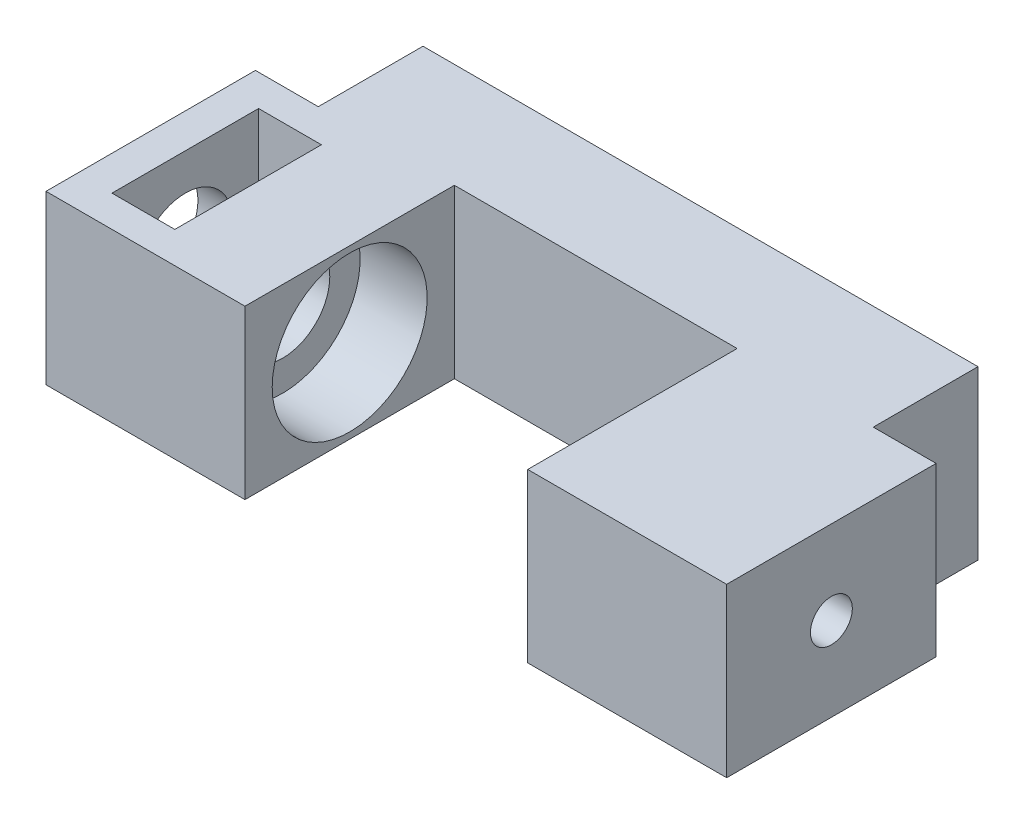
ISO-10303-21;
HEADER;
FILE_DESCRIPTION(('STEP AP214'),'2;1');
FILE_NAME('part.step','',(''),(''),'','','');
FILE_SCHEMA(('AUTOMOTIVE_DESIGN { 1 0 10303 214 1 1 1 1 }'));
ENDSEC;
DATA;
#1=APPLICATION_CONTEXT('core data for automotive mechanical design processes');
#2=APPLICATION_PROTOCOL_DEFINITION('international standard','automotive_design',2000,#1);
#3=PRODUCT_CONTEXT('',#1,'mechanical');
#4=PRODUCT('Part','Part','',(#3));
#5=PRODUCT_RELATED_PRODUCT_CATEGORY('part','',(#4));
#6=PRODUCT_DEFINITION_FORMATION('','',#4);
#7=PRODUCT_DEFINITION_CONTEXT('part definition',#1,'design');
#8=PRODUCT_DEFINITION('design','',#6,#7);
#9=PRODUCT_DEFINITION_SHAPE('','',#8);
#10=(LENGTH_UNIT() NAMED_UNIT(*) SI_UNIT(.MILLI.,.METRE.));
#11=(NAMED_UNIT(*) PLANE_ANGLE_UNIT() SI_UNIT($,.RADIAN.));
#12=(NAMED_UNIT(*) SI_UNIT($,.STERADIAN.) SOLID_ANGLE_UNIT());
#13=UNCERTAINTY_MEASURE_WITH_UNIT(LENGTH_MEASURE(1.E-05),#10,'distance_accuracy_value','');
#14=(GEOMETRIC_REPRESENTATION_CONTEXT(3) GLOBAL_UNCERTAINTY_ASSIGNED_CONTEXT((#13)) GLOBAL_UNIT_ASSIGNED_CONTEXT((#10,
#11,#12)) REPRESENTATION_CONTEXT('',''));
#15=CARTESIAN_POINT('',(0.,0.,0.));
#16=DIRECTION('',(0.,0.,1.));
#17=DIRECTION('',(1.,0.,0.));
#18=AXIS2_PLACEMENT_3D('',#15,#16,#17);
#19=CARTESIAN_POINT('',(-0.249999999999827,40.,-100.));
#20=DIRECTION('',(-1.,0.,0.));
#21=DIRECTION('',(0.,0.,1.));
#22=AXIS2_PLACEMENT_3D('',#19,#20,#21);
#23=CYLINDRICAL_SURFACE('',#22,2.25);
#24=CARTESIAN_POINT('',(-11.6,40.,-100.));
#25=DIRECTION('',(1.,0.,0.));
#26=DIRECTION('',(0.,0.,-1.));
#27=AXIS2_PLACEMENT_3D('',#24,#25,#26);
#28=CIRCLE('',#27,2.25);
#29=CARTESIAN_POINT('',(-11.6,40.,-102.25));
#30=VERTEX_POINT('',#29);
#31=EDGE_CURVE('E207',#30,#30,#28,.F.);
#32=ORIENTED_EDGE('',*,*,#31,.T.);
#33=EDGE_LOOP('',(#32));
#34=FACE_BOUND('',#33,.T.);
#35=CARTESIAN_POINT('',(-9.95000000000021,40.,-100.));
#36=DIRECTION('',(1.,0.,0.));
#37=DIRECTION('',(0.,0.,-1.));
#38=AXIS2_PLACEMENT_3D('',#35,#36,#37);
#39=CIRCLE('',#38,2.25);
#40=CARTESIAN_POINT('',(-9.95000000000021,40.,-102.25));
#41=VERTEX_POINT('',#40);
#42=EDGE_CURVE('E242',#41,#41,#39,.F.);
#43=ORIENTED_EDGE('',*,*,#42,.F.);
#44=EDGE_LOOP('',(#43));
#45=FACE_BOUND('',#44,.T.);
#46=ADVANCED_FACE('F33',(#34,#45),#23,.F.);
#47=CARTESIAN_POINT('',(-14.6,40.,-100.));
#48=DIRECTION('',(-1.,0.,0.));
#49=DIRECTION('',(0.,0.,1.));
#50=AXIS2_PLACEMENT_3D('',#47,#48,#49);
#51=CIRCLE('',#50,2.25);
#52=CARTESIAN_POINT('',(-14.6,40.,-97.75));
#53=VERTEX_POINT('',#52);
#54=EDGE_CURVE('E199',#53,#53,#51,.F.);
#55=ORIENTED_EDGE('',*,*,#54,.T.);
#56=EDGE_LOOP('',(#55));
#57=FACE_BOUND('',#56,.T.);
#58=CARTESIAN_POINT('',(-16.2499999999998,40.,-100.));
#59=DIRECTION('',(-1.,0.,0.));
#60=DIRECTION('',(0.,0.,1.));
#61=AXIS2_PLACEMENT_3D('',#58,#59,#60);
#62=CIRCLE('',#61,2.25);
#63=CARTESIAN_POINT('',(-16.2499999999998,40.,-97.75));
#64=VERTEX_POINT('',#63);
#65=EDGE_CURVE('E210',#64,#64,#62,.T.);
#66=ORIENTED_EDGE('',*,*,#65,.T.);
#67=EDGE_LOOP('',(#66));
#68=FACE_BOUND('',#67,.T.);
#69=ADVANCED_FACE('F333',(#57,#68),#23,.F.);
#70=CARTESIAN_POINT('',(-13.25,44.,-105.));
#71=DIRECTION('',(-1.,0.,0.));
#72=DIRECTION('',(0.,0.,1.));
#73=AXIS2_PLACEMENT_3D('',#70,#71,#72);
#74=PLANE('',#73);
#75=DIRECTION('',(0.,-1.,0.));
#76=VECTOR('',#75,1.);
#77=CARTESIAN_POINT('',(-13.2499999999998,44.,-105.));
#78=LINE('',#77,#76);
#79=CARTESIAN_POINT('',(-13.25,44.,-105.));
#80=VERTEX_POINT('',#79);
#81=CARTESIAN_POINT('',(-13.2499999999998,36.,-105.));
#82=VERTEX_POINT('',#81);
#83=EDGE_CURVE('E213',#80,#82,#78,.T.);
#84=ORIENTED_EDGE('',*,*,#83,.F.);
#85=DIRECTION('',(0.,0.,-1.));
#86=VECTOR('',#85,1.);
#87=CARTESIAN_POINT('',(-13.25,44.,-110.));
#88=LINE('',#87,#86);
#89=CARTESIAN_POINT('',(-13.25,44.,-110.));
#90=VERTEX_POINT('',#89);
#91=EDGE_CURVE('E266',#80,#90,#88,.T.);
#92=ORIENTED_EDGE('',*,*,#91,.T.);
#93=DIRECTION('',(0.,-1.,0.));
#94=VECTOR('',#93,1.);
#95=CARTESIAN_POINT('',(-13.25,44.,-110.));
#96=LINE('',#95,#94);
#97=CARTESIAN_POINT('',(-13.25,36.,-110.));
#98=VERTEX_POINT('',#97);
#99=EDGE_CURVE('E286',#90,#98,#96,.T.);
#100=ORIENTED_EDGE('',*,*,#99,.T.);
#101=DIRECTION('',(0.,0.,-1.));
#102=VECTOR('',#101,1.);
#103=CARTESIAN_POINT('',(-13.25,36.,-110.));
#104=LINE('',#103,#102);
#105=EDGE_CURVE('E248',#82,#98,#104,.T.);
#106=ORIENTED_EDGE('',*,*,#105,.F.);
#107=EDGE_LOOP('',(#84,#92,#100,#106));
#108=FACE_BOUND('',#107,.T.);
#109=ADVANCED_FACE('F361',(#108),#74,.T.);
#110=CARTESIAN_POINT('',(-13.25,44.,-95.));
#111=DIRECTION('',(0.,0.,1.));
#112=DIRECTION('',(1.,0.,0.));
#113=AXIS2_PLACEMENT_3D('',#110,#111,#112);
#114=PLANE('',#113);
#115=DIRECTION('',(-1.,0.,0.));
#116=VECTOR('',#115,1.);
#117=CARTESIAN_POINT('',(-13.25,44.,-95.));
#118=LINE('',#117,#116);
#119=CARTESIAN_POINT('',(-6.75,44.,-95.));
#120=VERTEX_POINT('',#119);
#121=CARTESIAN_POINT('',(-16.2499999999998,44.,-95.));
#122=VERTEX_POINT('',#121);
#123=EDGE_CURVE('E284',#120,#122,#118,.T.);
#124=ORIENTED_EDGE('',*,*,#123,.T.);
#125=DIRECTION('',(0.,1.,0.));
#126=VECTOR('',#125,1.);
#127=CARTESIAN_POINT('',(-16.2499999999998,44.,-95.));
#128=LINE('',#127,#126);
#129=CARTESIAN_POINT('',(-16.2499999999998,36.,-95.));
#130=VERTEX_POINT('',#129);
#131=EDGE_CURVE('E214',#130,#122,#128,.T.);
#132=ORIENTED_EDGE('',*,*,#131,.F.);
#133=DIRECTION('',(-1.,0.,0.));
#134=VECTOR('',#133,1.);
#135=CARTESIAN_POINT('',(-13.25,36.,-95.));
#136=LINE('',#135,#134);
#137=CARTESIAN_POINT('',(-6.75,36.,-95.));
#138=VERTEX_POINT('',#137);
#139=EDGE_CURVE('E264',#138,#130,#136,.T.);
#140=ORIENTED_EDGE('',*,*,#139,.F.);
#141=DIRECTION('',(0.,-1.,0.));
#142=VECTOR('',#141,1.);
#143=CARTESIAN_POINT('',(-6.75,44.,-95.));
#144=LINE('',#143,#142);
#145=EDGE_CURVE('E287',#120,#138,#144,.T.);
#146=ORIENTED_EDGE('',*,*,#145,.F.);
#147=EDGE_LOOP('',(#124,#132,#140,#146));
#148=FACE_BOUND('',#147,.T.);
#149=ADVANCED_FACE('F369',(#148),#114,.T.);
#150=CARTESIAN_POINT('',(-6.75,44.,-95.));
#151=DIRECTION('',(1.,0.,0.));
#152=DIRECTION('',(0.,0.,-1.));
#153=AXIS2_PLACEMENT_3D('',#150,#151,#152);
#154=PLANE('',#153);
#155=CARTESIAN_POINT('',(-6.75000000000021,40.,-100.));
#156=DIRECTION('',(-1.,0.,0.));
#157=DIRECTION('',(0.,0.,1.));
#158=AXIS2_PLACEMENT_3D('',#155,#156,#157);
#159=CIRCLE('',#158,3.7);
#160=CARTESIAN_POINT('',(-6.7500000000002,40.,-96.3));
#161=VERTEX_POINT('',#160);
#162=EDGE_CURVE('E236',#161,#161,#159,.T.);
#163=ORIENTED_EDGE('',*,*,#162,.T.);
#164=EDGE_LOOP('',(#163));
#165=FACE_BOUND('',#164,.T.);
#166=ORIENTED_EDGE('',*,*,#145,.T.);
#167=DIRECTION('',(0.,0.,1.));
#168=VECTOR('',#167,1.);
#169=CARTESIAN_POINT('',(-6.75,36.,-95.));
#170=LINE('',#169,#168);
#171=CARTESIAN_POINT('',(-6.75,36.,-105.));
#172=VERTEX_POINT('',#171);
#173=EDGE_CURVE('E261',#172,#138,#170,.T.);
#174=ORIENTED_EDGE('',*,*,#173,.F.);
#175=DIRECTION('',(0.,-1.,0.));
#176=VECTOR('',#175,1.);
#177=CARTESIAN_POINT('',(-6.75,44.,-105.));
#178=LINE('',#177,#176);
#179=CARTESIAN_POINT('',(-6.75,44.,-105.));
#180=VERTEX_POINT('',#179);
#181=EDGE_CURVE('E290',#180,#172,#178,.T.);
#182=ORIENTED_EDGE('',*,*,#181,.F.);
#183=DIRECTION('',(0.,0.,1.));
#184=VECTOR('',#183,1.);
#185=CARTESIAN_POINT('',(-6.75,44.,-95.));
#186=LINE('',#185,#184);
#187=EDGE_CURVE('E281',#180,#120,#186,.T.);
#188=ORIENTED_EDGE('',*,*,#187,.T.);
#189=EDGE_LOOP('',(#166,#174,#182,#188));
#190=FACE_BOUND('',#189,.T.);
#191=ADVANCED_FACE('F373',(#165,#190),#154,.T.);
#192=CARTESIAN_POINT('',(-6.75,44.,-105.));
#193=DIRECTION('',(0.,0.,1.));
#194=DIRECTION('',(1.,0.,0.));
#195=AXIS2_PLACEMENT_3D('',#192,#193,#194);
#196=PLANE('',#195);
#197=ORIENTED_EDGE('',*,*,#181,.T.);
#198=DIRECTION('',(-1.,0.,0.));
#199=VECTOR('',#198,1.);
#200=CARTESIAN_POINT('',(-6.75,36.,-105.));
#201=LINE('',#200,#199);
#202=CARTESIAN_POINT('',(6.75,36.,-105.));
#203=VERTEX_POINT('',#202);
#204=EDGE_CURVE('E258',#203,#172,#201,.T.);
#205=ORIENTED_EDGE('',*,*,#204,.F.);
#206=DIRECTION('',(0.,-1.,0.));
#207=VECTOR('',#206,1.);
#208=CARTESIAN_POINT('',(6.75,44.,-105.));
#209=LINE('',#208,#207);
#210=CARTESIAN_POINT('',(6.75,44.,-105.));
#211=VERTEX_POINT('',#210);
#212=EDGE_CURVE('E292',#211,#203,#209,.T.);
#213=ORIENTED_EDGE('',*,*,#212,.F.);
#214=DIRECTION('',(-1.,0.,0.));
#215=VECTOR('',#214,1.);
#216=CARTESIAN_POINT('',(-6.75,44.,-105.));
#217=LINE('',#216,#215);
#218=EDGE_CURVE('E278',#211,#180,#217,.T.);
#219=ORIENTED_EDGE('',*,*,#218,.T.);
#220=EDGE_LOOP('',(#197,#205,#213,#219));
#221=FACE_BOUND('',#220,.T.);
#222=ADVANCED_FACE('F377',(#221),#196,.T.);
#223=CARTESIAN_POINT('',(6.75,44.,-105.));
#224=DIRECTION('',(-1.,0.,0.));
#225=DIRECTION('',(0.,0.,1.));
#226=AXIS2_PLACEMENT_3D('',#223,#224,#225);
#227=PLANE('',#226);
#228=CARTESIAN_POINT('',(6.75000000000021,40.,-100.));
#229=DIRECTION('',(-1.,0.,0.));
#230=DIRECTION('',(0.,0.,1.));
#231=AXIS2_PLACEMENT_3D('',#228,#229,#230);
#232=CIRCLE('',#231,3.7);
#233=CARTESIAN_POINT('',(6.7500000000002,40.,-96.3));
#234=VERTEX_POINT('',#233);
#235=EDGE_CURVE('E249',#234,#234,#232,.T.);
#236=ORIENTED_EDGE('',*,*,#235,.F.);
#237=EDGE_LOOP('',(#236));
#238=FACE_BOUND('',#237,.T.);
#239=ORIENTED_EDGE('',*,*,#212,.T.);
#240=DIRECTION('',(0.,0.,-1.));
#241=VECTOR('',#240,1.);
#242=CARTESIAN_POINT('',(6.75,36.,-105.));
#243=LINE('',#242,#241);
#244=CARTESIAN_POINT('',(6.75,36.,-95.));
#245=VERTEX_POINT('',#244);
#246=EDGE_CURVE('E159',#245,#203,#243,.T.);
#247=ORIENTED_EDGE('',*,*,#246,.F.);
#248=DIRECTION('',(0.,-1.,0.));
#249=VECTOR('',#248,1.);
#250=CARTESIAN_POINT('',(6.75,44.,-95.));
#251=LINE('',#250,#249);
#252=CARTESIAN_POINT('',(6.75,44.,-95.));
#253=VERTEX_POINT('',#252);
#254=EDGE_CURVE('E155',#253,#245,#251,.T.);
#255=ORIENTED_EDGE('',*,*,#254,.F.);
#256=DIRECTION('',(0.,0.,-1.));
#257=VECTOR('',#256,1.);
#258=CARTESIAN_POINT('',(6.75,44.,-105.));
#259=LINE('',#258,#257);
#260=EDGE_CURVE('E275',#253,#211,#259,.T.);
#261=ORIENTED_EDGE('',*,*,#260,.T.);
#262=EDGE_LOOP('',(#239,#247,#255,#261));
#263=FACE_BOUND('',#262,.T.);
#264=ADVANCED_FACE('F381',(#238,#263),#227,.T.);
#265=CARTESIAN_POINT('',(6.75,44.,-95.));
#266=DIRECTION('',(0.,0.,1.));
#267=DIRECTION('',(1.,0.,0.));
#268=AXIS2_PLACEMENT_3D('',#265,#266,#267);
#269=PLANE('',#268);
#270=ORIENTED_EDGE('',*,*,#254,.T.);
#271=DIRECTION('',(-1.,0.,0.));
#272=VECTOR('',#271,1.);
#273=CARTESIAN_POINT('',(6.75,36.,-95.));
#274=LINE('',#273,#272);
#275=CARTESIAN_POINT('',(16.25,36.,-95.));
#276=VERTEX_POINT('',#275);
#277=EDGE_CURVE('E149',#276,#245,#274,.T.);
#278=ORIENTED_EDGE('',*,*,#277,.F.);
#279=DIRECTION('',(0.,-1.,0.));
#280=VECTOR('',#279,1.);
#281=CARTESIAN_POINT('',(16.25,36.,-95.));
#282=LINE('',#281,#280);
#283=CARTESIAN_POINT('',(16.25,44.,-95.));
#284=VERTEX_POINT('',#283);
#285=EDGE_CURVE('E154',#284,#276,#282,.T.);
#286=ORIENTED_EDGE('',*,*,#285,.F.);
#287=DIRECTION('',(-1.,0.,0.));
#288=VECTOR('',#287,1.);
#289=CARTESIAN_POINT('',(6.75,44.,-95.));
#290=LINE('',#289,#288);
#291=EDGE_CURVE('E273',#284,#253,#290,.T.);
#292=ORIENTED_EDGE('',*,*,#291,.T.);
#293=EDGE_LOOP('',(#270,#278,#286,#292));
#294=FACE_BOUND('',#293,.T.);
#295=ADVANCED_FACE('F151',(#294),#269,.T.);
#296=CARTESIAN_POINT('',(13.25,44.,-95.));
#297=DIRECTION('',(1.,0.,0.));
#298=DIRECTION('',(0.,0.,-1.));
#299=AXIS2_PLACEMENT_3D('',#296,#297,#298);
#300=PLANE('',#299);
#301=DIRECTION('',(0.,1.,0.));
#302=VECTOR('',#301,1.);
#303=CARTESIAN_POINT('',(13.25,36.,-105.));
#304=LINE('',#303,#302);
#305=CARTESIAN_POINT('',(13.25,36.,-105.));
#306=VERTEX_POINT('',#305);
#307=CARTESIAN_POINT('',(13.25,44.,-105.));
#308=VERTEX_POINT('',#307);
#309=EDGE_CURVE('E49',#306,#308,#304,.T.);
#310=ORIENTED_EDGE('',*,*,#309,.F.);
#311=DIRECTION('',(0.,0.,1.));
#312=VECTOR('',#311,1.);
#313=CARTESIAN_POINT('',(13.25,36.,-105.));
#314=LINE('',#313,#312);
#315=CARTESIAN_POINT('',(13.25,36.,-110.));
#316=VERTEX_POINT('',#315);
#317=EDGE_CURVE('E160',#316,#306,#314,.T.);
#318=ORIENTED_EDGE('',*,*,#317,.F.);
#319=DIRECTION('',(0.,-1.,0.));
#320=VECTOR('',#319,1.);
#321=CARTESIAN_POINT('',(13.25,44.,-110.));
#322=LINE('',#321,#320);
#323=CARTESIAN_POINT('',(13.25,44.,-110.));
#324=VERTEX_POINT('',#323);
#325=EDGE_CURVE('E295',#324,#316,#322,.T.);
#326=ORIENTED_EDGE('',*,*,#325,.F.);
#327=DIRECTION('',(0.,0.,1.));
#328=VECTOR('',#327,1.);
#329=CARTESIAN_POINT('',(13.25,44.,-105.));
#330=LINE('',#329,#328);
#331=EDGE_CURVE('E271',#324,#308,#330,.T.);
#332=ORIENTED_EDGE('',*,*,#331,.T.);
#333=EDGE_LOOP('',(#310,#318,#326,#332));
#334=FACE_BOUND('',#333,.T.);
#335=ADVANCED_FACE('F387',(#334),#300,.T.);
#336=CARTESIAN_POINT('',(13.25,44.,-110.));
#337=DIRECTION('',(0.,0.,-1.));
#338=DIRECTION('',(-1.,0.,0.));
#339=AXIS2_PLACEMENT_3D('',#336,#337,#338);
#340=PLANE('',#339);
#341=ORIENTED_EDGE('',*,*,#325,.T.);
#342=DIRECTION('',(1.,0.,0.));
#343=VECTOR('',#342,1.);
#344=CARTESIAN_POINT('',(13.25,36.,-110.));
#345=LINE('',#344,#343);
#346=EDGE_CURVE('E253',#98,#316,#345,.T.);
#347=ORIENTED_EDGE('',*,*,#346,.F.);
#348=ORIENTED_EDGE('',*,*,#99,.F.);
#349=DIRECTION('',(1.,0.,0.));
#350=VECTOR('',#349,1.);
#351=CARTESIAN_POINT('',(13.25,44.,-110.));
#352=LINE('',#351,#350);
#353=EDGE_CURVE('E268',#90,#324,#352,.T.);
#354=ORIENTED_EDGE('',*,*,#353,.T.);
#355=EDGE_LOOP('',(#341,#347,#348,#354));
#356=FACE_BOUND('',#355,.T.);
#357=ADVANCED_FACE('F35',(#356),#340,.T.);
#358=CARTESIAN_POINT('',(0.,44.,0.));
#359=DIRECTION('',(0.,1.,0.));
#360=DIRECTION('',(0.,0.,1.));
#361=AXIS2_PLACEMENT_3D('',#358,#359,#360);
#362=PLANE('',#361);
#363=DIRECTION('',(0.,0.,-1.));
#364=VECTOR('',#363,1.);
#365=CARTESIAN_POINT('',(-11.6,44.,-96.5));
#366=LINE('',#365,#364);
#367=CARTESIAN_POINT('',(-11.6,44.,-96.5));
#368=VERTEX_POINT('',#367);
#369=CARTESIAN_POINT('',(-11.6,44.,-103.5));
#370=VERTEX_POINT('',#369);
#371=EDGE_CURVE('E57',#368,#370,#366,.T.);
#372=ORIENTED_EDGE('',*,*,#371,.F.);
#373=DIRECTION('',(1.,0.,0.));
#374=VECTOR('',#373,1.);
#375=CARTESIAN_POINT('',(-14.6,44.,-96.5));
#376=LINE('',#375,#374);
#377=CARTESIAN_POINT('',(-14.6,44.,-96.5));
#378=VERTEX_POINT('',#377);
#379=EDGE_CURVE('E193',#378,#368,#376,.T.);
#380=ORIENTED_EDGE('',*,*,#379,.F.);
#381=DIRECTION('',(0.,0.,1.));
#382=VECTOR('',#381,1.);
#383=CARTESIAN_POINT('',(-14.6,44.,-96.5));
#384=LINE('',#383,#382);
#385=CARTESIAN_POINT('',(-14.6,44.,-103.5));
#386=VERTEX_POINT('',#385);
#387=EDGE_CURVE('E190',#386,#378,#384,.T.);
#388=ORIENTED_EDGE('',*,*,#387,.F.);
#389=DIRECTION('',(-1.,0.,0.));
#390=VECTOR('',#389,1.);
#391=CARTESIAN_POINT('',(-14.6,44.,-103.5));
#392=LINE('',#391,#390);
#393=EDGE_CURVE('E187',#370,#386,#392,.T.);
#394=ORIENTED_EDGE('',*,*,#393,.F.);
#395=EDGE_LOOP('',(#372,#380,#388,#394));
#396=FACE_BOUND('',#395,.T.);
#397=ORIENTED_EDGE('',*,*,#91,.F.);
#398=DIRECTION('',(1.,0.,0.));
#399=VECTOR('',#398,1.);
#400=CARTESIAN_POINT('',(-16.2499999999998,44.,-105.));
#401=LINE('',#400,#399);
#402=CARTESIAN_POINT('',(-16.2499999999998,44.,-105.));
#403=VERTEX_POINT('',#402);
#404=EDGE_CURVE('E229',#403,#80,#401,.T.);
#405=ORIENTED_EDGE('',*,*,#404,.F.);
#406=DIRECTION('',(0.,0.,-1.));
#407=VECTOR('',#406,1.);
#408=CARTESIAN_POINT('',(-16.2499999999998,44.,-95.));
#409=LINE('',#408,#407);
#410=EDGE_CURVE('E217',#122,#403,#409,.T.);
#411=ORIENTED_EDGE('',*,*,#410,.F.);
#412=ORIENTED_EDGE('',*,*,#123,.F.);
#413=ORIENTED_EDGE('',*,*,#187,.F.);
#414=ORIENTED_EDGE('',*,*,#218,.F.);
#415=ORIENTED_EDGE('',*,*,#260,.F.);
#416=ORIENTED_EDGE('',*,*,#291,.F.);
#417=DIRECTION('',(0.,0.,1.));
#418=VECTOR('',#417,1.);
#419=CARTESIAN_POINT('',(16.25,44.,-105.));
#420=LINE('',#419,#418);
#421=CARTESIAN_POINT('',(16.25,44.,-105.));
#422=VERTEX_POINT('',#421);
#423=EDGE_CURVE('E174',#422,#284,#420,.T.);
#424=ORIENTED_EDGE('',*,*,#423,.F.);
#425=DIRECTION('',(-1.,0.,0.));
#426=VECTOR('',#425,1.);
#427=CARTESIAN_POINT('',(16.25,44.,-105.));
#428=LINE('',#427,#426);
#429=EDGE_CURVE('E181',#422,#308,#428,.T.);
#430=ORIENTED_EDGE('',*,*,#429,.T.);
#431=ORIENTED_EDGE('',*,*,#331,.F.);
#432=ORIENTED_EDGE('',*,*,#353,.F.);
#433=EDGE_LOOP('',(#397,#405,#411,#412,#413,#414,#415,#416,#424,#430,#431,#432));
#434=FACE_BOUND('',#433,.T.);
#435=ADVANCED_FACE('F320',(#396,#434),#362,.T.);
#436=CARTESIAN_POINT('',(0.,36.,0.));
#437=DIRECTION('',(0.,1.,0.));
#438=DIRECTION('',(0.,0.,1.));
#439=AXIS2_PLACEMENT_3D('',#436,#437,#438);
#440=PLANE('',#439);
#441=DIRECTION('',(1.,0.,0.));
#442=VECTOR('',#441,1.);
#443=CARTESIAN_POINT('',(0.,36.,-96.5));
#444=LINE('',#443,#442);
#445=CARTESIAN_POINT('',(-14.6,36.,-96.5));
#446=VERTEX_POINT('',#445);
#447=CARTESIAN_POINT('',(-11.6,36.,-96.5));
#448=VERTEX_POINT('',#447);
#449=EDGE_CURVE('E42',#446,#448,#444,.T.);
#450=ORIENTED_EDGE('',*,*,#449,.T.);
#451=DIRECTION('',(0.,0.,-1.));
#452=VECTOR('',#451,1.);
#453=CARTESIAN_POINT('',(-11.6,36.,0.));
#454=LINE('',#453,#452);
#455=CARTESIAN_POINT('',(-11.6,36.,-103.5));
#456=VERTEX_POINT('',#455);
#457=EDGE_CURVE('E11',#448,#456,#454,.T.);
#458=ORIENTED_EDGE('',*,*,#457,.T.);
#459=DIRECTION('',(-1.,0.,0.));
#460=VECTOR('',#459,1.);
#461=CARTESIAN_POINT('',(0.,36.,-103.5));
#462=LINE('',#461,#460);
#463=CARTESIAN_POINT('',(-14.6,36.,-103.5));
#464=VERTEX_POINT('',#463);
#465=EDGE_CURVE('E289',#456,#464,#462,.T.);
#466=ORIENTED_EDGE('',*,*,#465,.T.);
#467=DIRECTION('',(0.,0.,1.));
#468=VECTOR('',#467,1.);
#469=CARTESIAN_POINT('',(-14.6,36.,0.));
#470=LINE('',#469,#468);
#471=EDGE_CURVE('E303',#464,#446,#470,.T.);
#472=ORIENTED_EDGE('',*,*,#471,.T.);
#473=EDGE_LOOP('',(#450,#458,#466,#472));
#474=FACE_BOUND('',#473,.T.);
#475=ORIENTED_EDGE('',*,*,#139,.T.);
#476=DIRECTION('',(0.,0.,1.));
#477=VECTOR('',#476,1.);
#478=CARTESIAN_POINT('',(-16.2499999999998,36.,-95.));
#479=LINE('',#478,#477);
#480=CARTESIAN_POINT('',(-16.2499999999998,36.,-105.));
#481=VERTEX_POINT('',#480);
#482=EDGE_CURVE('E221',#481,#130,#479,.T.);
#483=ORIENTED_EDGE('',*,*,#482,.F.);
#484=DIRECTION('',(1.,0.,0.));
#485=VECTOR('',#484,1.);
#486=CARTESIAN_POINT('',(-16.2499999999998,36.,-105.));
#487=LINE('',#486,#485);
#488=EDGE_CURVE('E224',#481,#82,#487,.T.);
#489=ORIENTED_EDGE('',*,*,#488,.T.);
#490=ORIENTED_EDGE('',*,*,#105,.T.);
#491=ORIENTED_EDGE('',*,*,#346,.T.);
#492=ORIENTED_EDGE('',*,*,#317,.T.);
#493=DIRECTION('',(-1.,0.,0.));
#494=VECTOR('',#493,1.);
#495=CARTESIAN_POINT('',(16.25,36.,-105.));
#496=LINE('',#495,#494);
#497=CARTESIAN_POINT('',(16.25,36.,-105.));
#498=VERTEX_POINT('',#497);
#499=EDGE_CURVE('E166',#498,#306,#496,.T.);
#500=ORIENTED_EDGE('',*,*,#499,.F.);
#501=DIRECTION('',(0.,0.,-1.));
#502=VECTOR('',#501,1.);
#503=CARTESIAN_POINT('',(16.25,36.,-105.));
#504=LINE('',#503,#502);
#505=EDGE_CURVE('E163',#276,#498,#504,.T.);
#506=ORIENTED_EDGE('',*,*,#505,.F.);
#507=ORIENTED_EDGE('',*,*,#277,.T.);
#508=ORIENTED_EDGE('',*,*,#246,.T.);
#509=ORIENTED_EDGE('',*,*,#204,.T.);
#510=ORIENTED_EDGE('',*,*,#173,.T.);
#511=EDGE_LOOP('',(#475,#483,#489,#490,#491,#492,#500,#506,#507,#508,#509,#510));
#512=FACE_BOUND('',#511,.T.);
#513=ADVANCED_FACE('F164',(#474,#512),#440,.F.);
#514=CARTESIAN_POINT('',(9.95000000000021,40.,-100.));
#515=DIRECTION('',(-1.,0.,0.));
#516=DIRECTION('',(0.,0.,1.));
#517=AXIS2_PLACEMENT_3D('',#514,#515,#516);
#518=CYLINDRICAL_SURFACE('',#517,3.7);
#519=CARTESIAN_POINT('',(9.95000000000021,40.,-100.));
#520=DIRECTION('',(-1.,0.,0.));
#521=DIRECTION('',(0.,0.,1.));
#522=AXIS2_PLACEMENT_3D('',#519,#520,#521);
#523=CIRCLE('',#522,3.7);
#524=CARTESIAN_POINT('',(9.9500000000002,40.,-96.3));
#525=VERTEX_POINT('',#524);
#526=EDGE_CURVE('E245',#525,#525,#523,.T.);
#527=ORIENTED_EDGE('',*,*,#526,.F.);
#528=EDGE_LOOP('',(#527));
#529=FACE_BOUND('',#528,.T.);
#530=ORIENTED_EDGE('',*,*,#235,.T.);
#531=EDGE_LOOP('',(#530));
#532=FACE_BOUND('',#531,.T.);
#533=ADVANCED_FACE('F350',(#529,#532),#518,.F.);
#534=CARTESIAN_POINT('',(9.95000000000021,40.,-100.));
#535=DIRECTION('',(-1.,0.,0.));
#536=DIRECTION('',(0.,0.,1.));
#537=AXIS2_PLACEMENT_3D('',#534,#535,#536);
#538=PLANE('',#537);
#539=CARTESIAN_POINT('',(9.95000000000021,40.,-100.));
#540=DIRECTION('',(-1.,0.,0.));
#541=DIRECTION('',(0.,0.,1.));
#542=AXIS2_PLACEMENT_3D('',#539,#540,#541);
#543=CIRCLE('',#542,2.2);
#544=CARTESIAN_POINT('',(9.95000000000021,40.,-97.8));
#545=VERTEX_POINT('',#544);
#546=EDGE_CURVE('E232',#545,#545,#543,.T.);
#547=ORIENTED_EDGE('',*,*,#546,.F.);
#548=EDGE_LOOP('',(#547));
#549=FACE_BOUND('',#548,.T.);
#550=ORIENTED_EDGE('',*,*,#526,.T.);
#551=EDGE_LOOP('',(#550));
#552=FACE_BOUND('',#551,.T.);
#553=ADVANCED_FACE('F340',(#549,#552),#538,.T.);
#554=CARTESIAN_POINT('',(-9.95000000000021,40.,-100.));
#555=DIRECTION('',(1.,0.,0.));
#556=DIRECTION('',(0.,0.,1.));
#557=AXIS2_PLACEMENT_3D('',#554,#555,#556);
#558=PLANE('',#557);
#559=CARTESIAN_POINT('',(-9.95000000000021,40.,-100.));
#560=DIRECTION('',(-1.,0.,0.));
#561=DIRECTION('',(0.,0.,1.));
#562=AXIS2_PLACEMENT_3D('',#559,#560,#561);
#563=CIRCLE('',#562,3.7);
#564=CARTESIAN_POINT('',(-9.9500000000002,40.,-96.3));
#565=VERTEX_POINT('',#564);
#566=EDGE_CURVE('E239',#565,#565,#563,.T.);
#567=ORIENTED_EDGE('',*,*,#566,.F.);
#568=EDGE_LOOP('',(#567));
#569=FACE_BOUND('',#568,.T.);
#570=ORIENTED_EDGE('',*,*,#42,.T.);
#571=EDGE_LOOP('',(#570));
#572=FACE_BOUND('',#571,.T.);
#573=ADVANCED_FACE('F337',(#569,#572),#558,.T.);
#574=CARTESIAN_POINT('',(-9.95000000000021,40.,-100.));
#575=DIRECTION('',(1.,0.,0.));
#576=DIRECTION('',(0.,0.,-1.));
#577=AXIS2_PLACEMENT_3D('',#574,#575,#576);
#578=CYLINDRICAL_SURFACE('',#577,3.7);
#579=ORIENTED_EDGE('',*,*,#566,.T.);
#580=EDGE_LOOP('',(#579));
#581=FACE_BOUND('',#580,.T.);
#582=ORIENTED_EDGE('',*,*,#162,.F.);
#583=EDGE_LOOP('',(#582));
#584=FACE_BOUND('',#583,.T.);
#585=ADVANCED_FACE('F339',(#581,#584),#578,.F.);
#586=CARTESIAN_POINT('',(10.9500000000002,40.,-100.));
#587=DIRECTION('',(-1.,0.,0.));
#588=DIRECTION('',(0.,0.,1.));
#589=AXIS2_PLACEMENT_3D('',#586,#587,#588);
#590=CYLINDRICAL_SURFACE('',#589,2.2);
#591=CARTESIAN_POINT('',(10.9500000000002,40.,-100.));
#592=DIRECTION('',(-1.,0.,0.));
#593=DIRECTION('',(0.,0.,1.));
#594=AXIS2_PLACEMENT_3D('',#591,#592,#593);
#595=CIRCLE('',#594,2.2);
#596=CARTESIAN_POINT('',(10.9500000000002,40.,-97.8));
#597=VERTEX_POINT('',#596);
#598=EDGE_CURVE('E233',#597,#597,#595,.T.);
#599=ORIENTED_EDGE('',*,*,#598,.F.);
#600=EDGE_LOOP('',(#599));
#601=FACE_BOUND('',#600,.T.);
#602=ORIENTED_EDGE('',*,*,#546,.T.);
#603=EDGE_LOOP('',(#602));
#604=FACE_BOUND('',#603,.T.);
#605=ADVANCED_FACE('F347',(#601,#604),#590,.F.);
#606=CARTESIAN_POINT('',(10.9500000000002,40.,-100.));
#607=DIRECTION('',(-1.,0.,0.));
#608=DIRECTION('',(0.,0.,1.));
#609=AXIS2_PLACEMENT_3D('',#606,#607,#608);
#610=PLANE('',#609);
#611=CARTESIAN_POINT('',(10.9500000000002,40.,-100.));
#612=DIRECTION('',(-1.,0.,0.));
#613=DIRECTION('',(0.,0.,1.));
#614=AXIS2_PLACEMENT_3D('',#611,#612,#613);
#615=CIRCLE('',#614,0.999999999999998);
#616=CARTESIAN_POINT('',(10.9500000000002,40.,-99.));
#617=VERTEX_POINT('',#616);
#618=EDGE_CURVE('E178',#617,#617,#615,.T.);
#619=ORIENTED_EDGE('',*,*,#618,.F.);
#620=EDGE_LOOP('',(#619));
#621=FACE_BOUND('',#620,.T.);
#622=ORIENTED_EDGE('',*,*,#598,.T.);
#623=EDGE_LOOP('',(#622));
#624=FACE_BOUND('',#623,.T.);
#625=ADVANCED_FACE('F427',(#621,#624),#610,.T.);
#626=CARTESIAN_POINT('',(-16.25,0.,0.));
#627=DIRECTION('',(1.,0.,0.));
#628=DIRECTION('',(0.,0.,-1.));
#629=AXIS2_PLACEMENT_3D('',#626,#627,#628);
#630=PLANE('',#629);
#631=ORIENTED_EDGE('',*,*,#131,.T.);
#632=ORIENTED_EDGE('',*,*,#410,.T.);
#633=DIRECTION('',(0.,-1.,0.));
#634=VECTOR('',#633,1.);
#635=CARTESIAN_POINT('',(-16.2499999999998,44.,-105.));
#636=LINE('',#635,#634);
#637=EDGE_CURVE('E219',#403,#481,#636,.T.);
#638=ORIENTED_EDGE('',*,*,#637,.T.);
#639=ORIENTED_EDGE('',*,*,#482,.T.);
#640=EDGE_LOOP('',(#631,#632,#638,#639));
#641=FACE_BOUND('',#640,.T.);
#642=ORIENTED_EDGE('',*,*,#65,.F.);
#643=EDGE_LOOP('',(#642));
#644=FACE_BOUND('',#643,.T.);
#645=ADVANCED_FACE('F418',(#641,#644),#630,.F.);
#646=CARTESIAN_POINT('',(-16.2499999999998,44.,-105.));
#647=DIRECTION('',(0.,0.,1.));
#648=DIRECTION('',(1.,0.,0.));
#649=AXIS2_PLACEMENT_3D('',#646,#647,#648);
#650=PLANE('',#649);
#651=ORIENTED_EDGE('',*,*,#83,.T.);
#652=ORIENTED_EDGE('',*,*,#488,.F.);
#653=ORIENTED_EDGE('',*,*,#637,.F.);
#654=ORIENTED_EDGE('',*,*,#404,.T.);
#655=EDGE_LOOP('',(#651,#652,#653,#654));
#656=FACE_BOUND('',#655,.T.);
#657=ADVANCED_FACE('F327',(#656),#650,.F.);
#658=CARTESIAN_POINT('',(-11.6,34.,-96.5));
#659=DIRECTION('',(1.,0.,0.));
#660=DIRECTION('',(0.,0.,-1.));
#661=AXIS2_PLACEMENT_3D('',#658,#659,#660);
#662=PLANE('',#661);
#663=DIRECTION('',(0.,1.,0.));
#664=VECTOR('',#663,1.);
#665=CARTESIAN_POINT('',(-11.6,34.,-96.5));
#666=LINE('',#665,#664);
#667=EDGE_CURVE('E197',#448,#368,#666,.T.);
#668=ORIENTED_EDGE('',*,*,#667,.T.);
#669=ORIENTED_EDGE('',*,*,#371,.T.);
#670=DIRECTION('',(0.,1.,0.));
#671=VECTOR('',#670,1.);
#672=CARTESIAN_POINT('',(-11.6,34.,-103.5));
#673=LINE('',#672,#671);
#674=EDGE_CURVE('E196',#456,#370,#673,.T.);
#675=ORIENTED_EDGE('',*,*,#674,.F.);
#676=ORIENTED_EDGE('',*,*,#457,.F.);
#677=EDGE_LOOP('',(#668,#669,#675,#676));
#678=FACE_BOUND('',#677,.T.);
#679=ORIENTED_EDGE('',*,*,#31,.F.);
#680=EDGE_LOOP('',(#679));
#681=FACE_BOUND('',#680,.T.);
#682=ADVANCED_FACE('F324',(#678,#681),#662,.F.);
#683=CARTESIAN_POINT('',(-14.6,34.,-96.5));
#684=DIRECTION('',(0.,0.,1.));
#685=DIRECTION('',(1.,0.,0.));
#686=AXIS2_PLACEMENT_3D('',#683,#684,#685);
#687=PLANE('',#686);
#688=DIRECTION('',(0.,1.,0.));
#689=VECTOR('',#688,1.);
#690=CARTESIAN_POINT('',(-14.6,34.,-96.5));
#691=LINE('',#690,#689);
#692=EDGE_CURVE('E200',#446,#378,#691,.T.);
#693=ORIENTED_EDGE('',*,*,#692,.T.);
#694=ORIENTED_EDGE('',*,*,#379,.T.);
#695=ORIENTED_EDGE('',*,*,#667,.F.);
#696=ORIENTED_EDGE('',*,*,#449,.F.);
#697=EDGE_LOOP('',(#693,#694,#695,#696));
#698=FACE_BOUND('',#697,.T.);
#699=ADVANCED_FACE('F312',(#698),#687,.F.);
#700=CARTESIAN_POINT('',(-14.6,34.,-96.5));
#701=DIRECTION('',(-1.,0.,0.));
#702=DIRECTION('',(0.,0.,1.));
#703=AXIS2_PLACEMENT_3D('',#700,#701,#702);
#704=PLANE('',#703);
#705=DIRECTION('',(0.,1.,0.));
#706=VECTOR('',#705,1.);
#707=CARTESIAN_POINT('',(-14.6,34.,-103.5));
#708=LINE('',#707,#706);
#709=EDGE_CURVE('E202',#464,#386,#708,.T.);
#710=ORIENTED_EDGE('',*,*,#709,.T.);
#711=ORIENTED_EDGE('',*,*,#387,.T.);
#712=ORIENTED_EDGE('',*,*,#692,.F.);
#713=ORIENTED_EDGE('',*,*,#471,.F.);
#714=EDGE_LOOP('',(#710,#711,#712,#713));
#715=FACE_BOUND('',#714,.T.);
#716=ORIENTED_EDGE('',*,*,#54,.F.);
#717=EDGE_LOOP('',(#716));
#718=FACE_BOUND('',#717,.T.);
#719=ADVANCED_FACE('F314',(#715,#718),#704,.F.);
#720=CARTESIAN_POINT('',(-14.6,34.,-103.5));
#721=DIRECTION('',(0.,0.,-1.));
#722=DIRECTION('',(-1.,0.,0.));
#723=AXIS2_PLACEMENT_3D('',#720,#721,#722);
#724=PLANE('',#723);
#725=ORIENTED_EDGE('',*,*,#674,.T.);
#726=ORIENTED_EDGE('',*,*,#393,.T.);
#727=ORIENTED_EDGE('',*,*,#709,.F.);
#728=ORIENTED_EDGE('',*,*,#465,.F.);
#729=EDGE_LOOP('',(#725,#726,#727,#728));
#730=FACE_BOUND('',#729,.T.);
#731=ADVANCED_FACE('F323',(#730),#724,.F.);
#732=CARTESIAN_POINT('',(16.25,36.,-105.));
#733=DIRECTION('',(0.,0.,1.));
#734=DIRECTION('',(1.,0.,0.));
#735=AXIS2_PLACEMENT_3D('',#732,#733,#734);
#736=PLANE('',#735);
#737=ORIENTED_EDGE('',*,*,#309,.T.);
#738=ORIENTED_EDGE('',*,*,#429,.F.);
#739=DIRECTION('',(0.,1.,0.));
#740=VECTOR('',#739,1.);
#741=CARTESIAN_POINT('',(16.25,36.,-105.));
#742=LINE('',#741,#740);
#743=EDGE_CURVE('E169',#498,#422,#742,.T.);
#744=ORIENTED_EDGE('',*,*,#743,.F.);
#745=ORIENTED_EDGE('',*,*,#499,.T.);
#746=EDGE_LOOP('',(#737,#738,#744,#745));
#747=FACE_BOUND('',#746,.T.);
#748=ADVANCED_FACE('F405',(#747),#736,.F.);
#749=CARTESIAN_POINT('',(16.25,0.,0.));
#750=DIRECTION('',(1.,0.,0.));
#751=DIRECTION('',(0.,0.,-1.));
#752=AXIS2_PLACEMENT_3D('',#749,#750,#751);
#753=PLANE('',#752);
#754=CARTESIAN_POINT('',(16.25,40.,-100.));
#755=DIRECTION('',(1.,0.,0.));
#756=DIRECTION('',(0.,0.,-1.));
#757=AXIS2_PLACEMENT_3D('',#754,#755,#756);
#758=CIRCLE('',#757,0.999999999999998);
#759=CARTESIAN_POINT('',(16.25,40.,-101.));
#760=VERTEX_POINT('',#759);
#761=EDGE_CURVE('E37',#760,#760,#758,.T.);
#762=ORIENTED_EDGE('',*,*,#761,.F.);
#763=EDGE_LOOP('',(#762));
#764=FACE_BOUND('',#763,.T.);
#765=ORIENTED_EDGE('',*,*,#285,.T.);
#766=ORIENTED_EDGE('',*,*,#505,.T.);
#767=ORIENTED_EDGE('',*,*,#743,.T.);
#768=ORIENTED_EDGE('',*,*,#423,.T.);
#769=EDGE_LOOP('',(#765,#766,#767,#768));
#770=FACE_BOUND('',#769,.T.);
#771=ADVANCED_FACE('F172',(#764,#770),#753,.T.);
#772=CARTESIAN_POINT('',(20.9500000000002,40.,-100.));
#773=DIRECTION('',(-1.,0.,0.));
#774=DIRECTION('',(0.,0.,1.));
#775=AXIS2_PLACEMENT_3D('',#772,#773,#774);
#776=CYLINDRICAL_SURFACE('',#775,0.999999999999998);
#777=ORIENTED_EDGE('',*,*,#761,.T.);
#778=EDGE_LOOP('',(#777));
#779=FACE_BOUND('',#778,.T.);
#780=ORIENTED_EDGE('',*,*,#618,.T.);
#781=EDGE_LOOP('',(#780));
#782=FACE_BOUND('',#781,.T.);
#783=ADVANCED_FACE('F449',(#779,#782),#776,.F.);
#784=CLOSED_SHELL('',(#46,#69,#109,#149,#191,#222,#264,#295,#335,#357,#435,#513,#533,#553,#573,
#585,#605,#625,#645,#657,#682,#699,#719,#731,#748,#771,#783));
#785=MANIFOLD_SOLID_BREP('B2',#784);
#786=ADVANCED_BREP_SHAPE_REPRESENTATION('',(#18,#785),#14);
#787=SHAPE_DEFINITION_REPRESENTATION(#9,#786);
ENDSEC;
END-ISO-10303-21;
